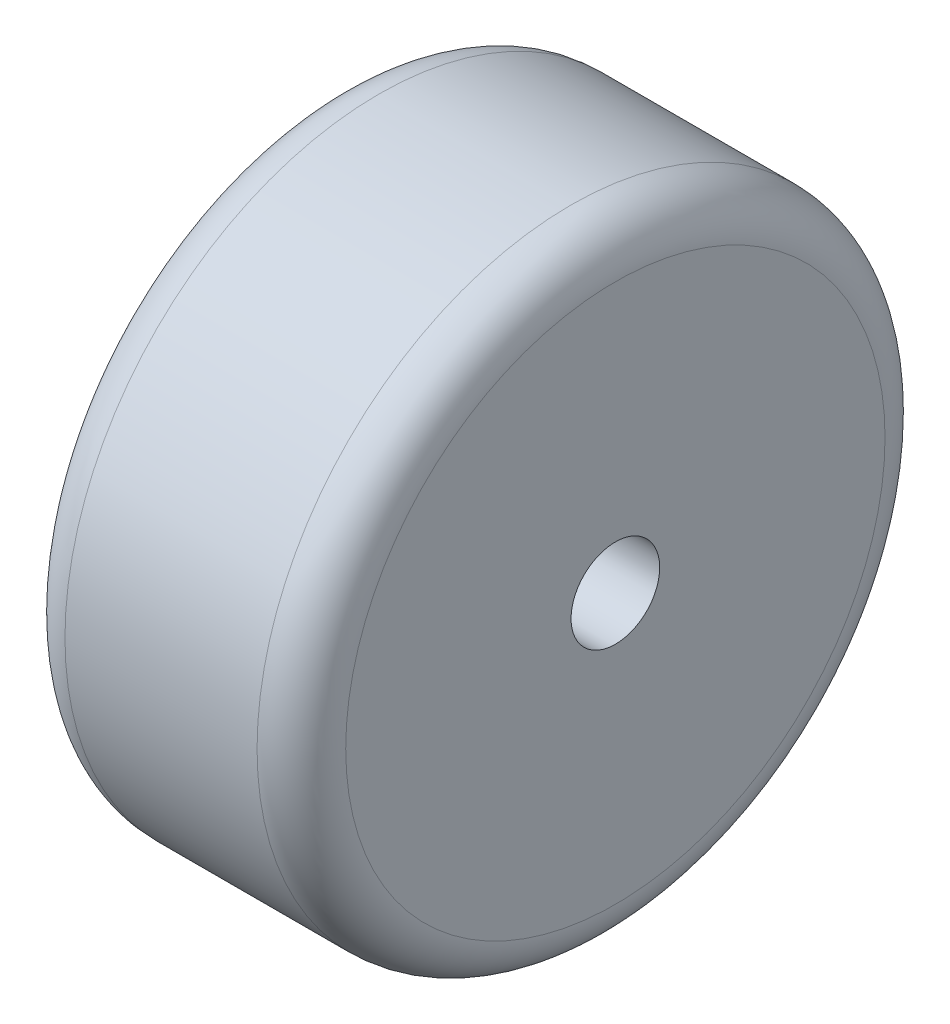
ISO-10303-21;
HEADER;
FILE_DESCRIPTION(('STEP AP214'),'2;1');
FILE_NAME('part.step','',(''),(''),'','','');
FILE_SCHEMA(('AUTOMOTIVE_DESIGN { 1 0 10303 214 1 1 1 1 }'));
ENDSEC;
DATA;
#1=APPLICATION_CONTEXT('core data for automotive mechanical design processes');
#2=APPLICATION_PROTOCOL_DEFINITION('international standard','automotive_design',2000,#1);
#3=PRODUCT_CONTEXT('',#1,'mechanical');
#4=PRODUCT('Part','Part','',(#3));
#5=PRODUCT_RELATED_PRODUCT_CATEGORY('part','',(#4));
#6=PRODUCT_DEFINITION_FORMATION('','',#4);
#7=PRODUCT_DEFINITION_CONTEXT('part definition',#1,'design');
#8=PRODUCT_DEFINITION('design','',#6,#7);
#9=PRODUCT_DEFINITION_SHAPE('','',#8);
#10=(LENGTH_UNIT() NAMED_UNIT(*) SI_UNIT(.MILLI.,.METRE.));
#11=(NAMED_UNIT(*) PLANE_ANGLE_UNIT() SI_UNIT($,.RADIAN.));
#12=(NAMED_UNIT(*) SI_UNIT($,.STERADIAN.) SOLID_ANGLE_UNIT());
#13=UNCERTAINTY_MEASURE_WITH_UNIT(LENGTH_MEASURE(1.E-05),#10,'distance_accuracy_value','');
#14=(GEOMETRIC_REPRESENTATION_CONTEXT(3) GLOBAL_UNCERTAINTY_ASSIGNED_CONTEXT((#13)) GLOBAL_UNIT_ASSIGNED_CONTEXT((#10,
#11,#12)) REPRESENTATION_CONTEXT('',''));
#15=CARTESIAN_POINT('',(0.,0.,0.));
#16=DIRECTION('',(0.,0.,1.));
#17=DIRECTION('',(1.,0.,0.));
#18=AXIS2_PLACEMENT_3D('',#15,#16,#17);
#19=CARTESIAN_POINT('',(38.,0.,0.));
#20=DIRECTION('',(-1.,0.,0.));
#21=DIRECTION('',(0.,0.,1.));
#22=AXIS2_PLACEMENT_3D('',#19,#20,#21);
#23=CYLINDRICAL_SURFACE('',#22,42.5);
#24=CARTESIAN_POINT('',(6.,0.,0.));
#25=DIRECTION('',(1.,0.,0.));
#26=DIRECTION('',(0.,0.,-1.));
#27=AXIS2_PLACEMENT_3D('',#24,#25,#26);
#28=CIRCLE('',#27,42.5);
#29=CARTESIAN_POINT('',(6.,0.,-42.5));
#30=VERTEX_POINT('',#29);
#31=EDGE_CURVE('E44',#30,#30,#28,.T.);
#32=ORIENTED_EDGE('',*,*,#31,.T.);
#33=EDGE_LOOP('',(#32));
#34=FACE_BOUND('',#33,.T.);
#35=CARTESIAN_POINT('',(32.,0.,0.));
#36=DIRECTION('',(1.,0.,0.));
#37=DIRECTION('',(0.,0.,-1.));
#38=AXIS2_PLACEMENT_3D('',#35,#36,#37);
#39=CIRCLE('',#38,42.5);
#40=CARTESIAN_POINT('',(32.,0.,-42.5));
#41=VERTEX_POINT('',#40);
#42=EDGE_CURVE('E48',#41,#41,#39,.F.);
#43=ORIENTED_EDGE('',*,*,#42,.T.);
#44=EDGE_LOOP('',(#43));
#45=FACE_BOUND('',#44,.T.);
#46=ADVANCED_FACE('F33',(#34,#45),#23,.T.);
#47=CARTESIAN_POINT('',(38.,0.,0.));
#48=DIRECTION('',(1.,0.,0.));
#49=DIRECTION('',(0.,0.,-1.));
#50=AXIS2_PLACEMENT_3D('',#47,#48,#49);
#51=PLANE('',#50);
#52=CARTESIAN_POINT('',(38.,0.,0.));
#53=DIRECTION('',(1.,0.,0.));
#54=DIRECTION('',(0.,0.,-1.));
#55=AXIS2_PLACEMENT_3D('',#52,#53,#54);
#56=CIRCLE('',#55,6.);
#57=CARTESIAN_POINT('',(38.,0.,-6.));
#58=VERTEX_POINT('',#57);
#59=EDGE_CURVE('E54',#58,#58,#56,.T.);
#60=ORIENTED_EDGE('',*,*,#59,.F.);
#61=EDGE_LOOP('',(#60));
#62=FACE_BOUND('',#61,.T.);
#63=CARTESIAN_POINT('',(38.,0.,0.));
#64=DIRECTION('',(1.,0.,0.));
#65=DIRECTION('',(0.,0.,-1.));
#66=AXIS2_PLACEMENT_3D('',#63,#64,#65);
#67=CIRCLE('',#66,36.5);
#68=CARTESIAN_POINT('',(38.,0.,-36.5));
#69=VERTEX_POINT('',#68);
#70=EDGE_CURVE('E10',#69,#69,#67,.T.);
#71=ORIENTED_EDGE('',*,*,#70,.T.);
#72=EDGE_LOOP('',(#71));
#73=FACE_BOUND('',#72,.T.);
#74=ADVANCED_FACE('F68',(#62,#73),#51,.T.);
#75=CARTESIAN_POINT('',(0.,0.,0.));
#76=DIRECTION('',(1.,0.,0.));
#77=DIRECTION('',(0.,0.,-1.));
#78=AXIS2_PLACEMENT_3D('',#75,#76,#77);
#79=PLANE('',#78);
#80=CARTESIAN_POINT('',(0.,0.,0.));
#81=DIRECTION('',(1.,0.,0.));
#82=DIRECTION('',(0.,0.,-1.));
#83=AXIS2_PLACEMENT_3D('',#80,#81,#82);
#84=CIRCLE('',#83,6.);
#85=CARTESIAN_POINT('',(0.,0.,-6.));
#86=VERTEX_POINT('',#85);
#87=EDGE_CURVE('E53',#86,#86,#84,.T.);
#88=ORIENTED_EDGE('',*,*,#87,.T.);
#89=EDGE_LOOP('',(#88));
#90=FACE_BOUND('',#89,.T.);
#91=CARTESIAN_POINT('',(0.,0.,0.));
#92=DIRECTION('',(1.,0.,0.));
#93=DIRECTION('',(0.,0.,-1.));
#94=AXIS2_PLACEMENT_3D('',#91,#92,#93);
#95=CIRCLE('',#94,36.5);
#96=CARTESIAN_POINT('',(0.,0.,-36.5));
#97=VERTEX_POINT('',#96);
#98=EDGE_CURVE('E40',#97,#97,#95,.F.);
#99=ORIENTED_EDGE('',*,*,#98,.T.);
#100=EDGE_LOOP('',(#99));
#101=FACE_BOUND('',#100,.T.);
#102=ADVANCED_FACE('F60',(#90,#101),#79,.F.);
#103=CARTESIAN_POINT('',(6.,0.,0.));
#104=DIRECTION('',(1.,0.,0.));
#105=DIRECTION('',(0.,0.,-1.));
#106=AXIS2_PLACEMENT_3D('',#103,#104,#105);
#107=TOROIDAL_SURFACE('',#106,36.5,6.);
#108=ORIENTED_EDGE('',*,*,#98,.F.);
#109=EDGE_LOOP('',(#108));
#110=FACE_BOUND('',#109,.T.);
#111=ORIENTED_EDGE('',*,*,#31,.F.);
#112=EDGE_LOOP('',(#111));
#113=FACE_BOUND('',#112,.T.);
#114=ADVANCED_FACE('F75',(#110,#113),#107,.T.);
#115=CARTESIAN_POINT('',(32.,0.,0.));
#116=DIRECTION('',(1.,0.,0.));
#117=DIRECTION('',(0.,0.,-1.));
#118=AXIS2_PLACEMENT_3D('',#115,#116,#117);
#119=TOROIDAL_SURFACE('',#118,36.5,6.);
#120=ORIENTED_EDGE('',*,*,#42,.F.);
#121=EDGE_LOOP('',(#120));
#122=FACE_BOUND('',#121,.T.);
#123=ORIENTED_EDGE('',*,*,#70,.F.);
#124=EDGE_LOOP('',(#123));
#125=FACE_BOUND('',#124,.T.);
#126=ADVANCED_FACE('F35',(#122,#125),#119,.T.);
#127=CARTESIAN_POINT('',(0.,0.,0.));
#128=DIRECTION('',(1.,0.,0.));
#129=DIRECTION('',(0.,0.,-1.));
#130=AXIS2_PLACEMENT_3D('',#127,#128,#129);
#131=CYLINDRICAL_SURFACE('',#130,6.);
#132=ORIENTED_EDGE('',*,*,#87,.F.);
#133=EDGE_LOOP('',(#132));
#134=FACE_BOUND('',#133,.T.);
#135=ORIENTED_EDGE('',*,*,#59,.T.);
#136=EDGE_LOOP('',(#135));
#137=FACE_BOUND('',#136,.T.);
#138=ADVANCED_FACE('F62',(#134,#137),#131,.F.);
#139=CLOSED_SHELL('',(#46,#74,#102,#114,#126,#138));
#140=MANIFOLD_SOLID_BREP('B2',#139);
#141=ADVANCED_BREP_SHAPE_REPRESENTATION('',(#18,#140),#14);
#142=SHAPE_DEFINITION_REPRESENTATION(#9,#141);
ENDSEC;
END-ISO-10303-21;
